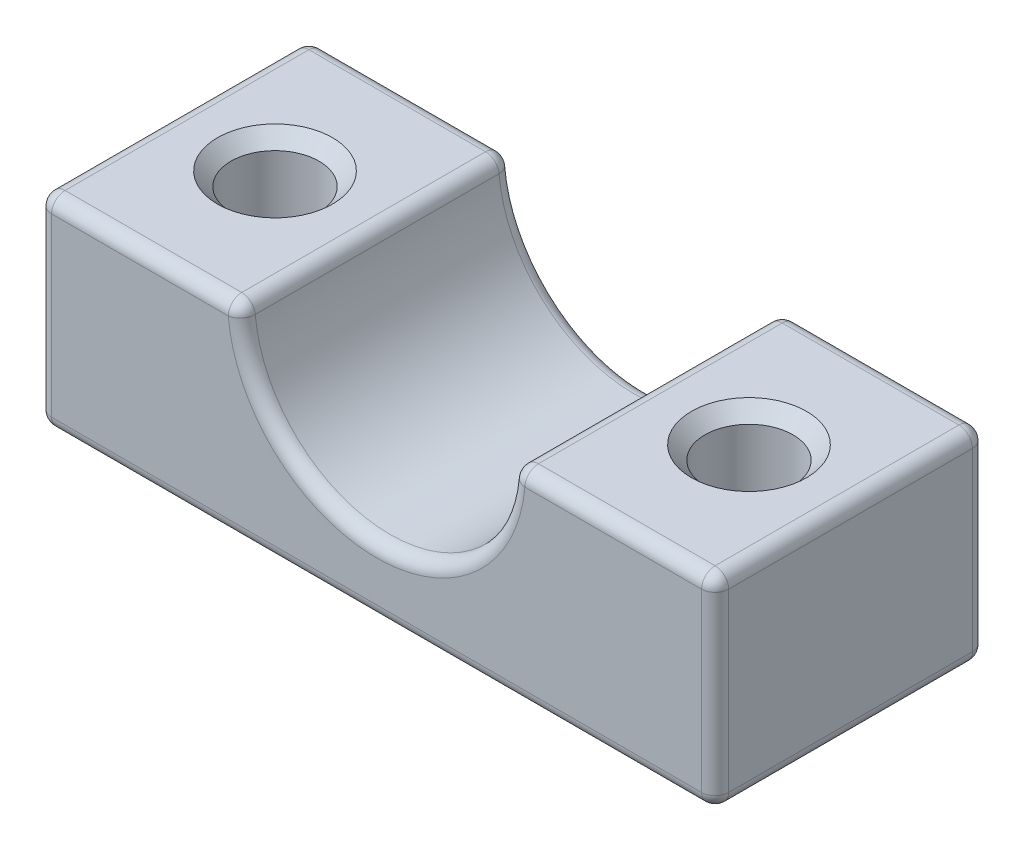
ISO-10303-21;
HEADER;
FILE_DESCRIPTION(('STEP AP214'),'2;1');
FILE_NAME('part.step','',(''),(''),'','','');
FILE_SCHEMA(('AUTOMOTIVE_DESIGN { 1 0 10303 214 1 1 1 1 }'));
ENDSEC;
DATA;
#1=APPLICATION_CONTEXT('core data for automotive mechanical design processes');
#2=APPLICATION_PROTOCOL_DEFINITION('international standard','automotive_design',2000,#1);
#3=PRODUCT_CONTEXT('',#1,'mechanical');
#4=PRODUCT('Part','Part','',(#3));
#5=PRODUCT_RELATED_PRODUCT_CATEGORY('part','',(#4));
#6=PRODUCT_DEFINITION_FORMATION('','',#4);
#7=PRODUCT_DEFINITION_CONTEXT('part definition',#1,'design');
#8=PRODUCT_DEFINITION('design','',#6,#7);
#9=PRODUCT_DEFINITION_SHAPE('','',#8);
#10=(LENGTH_UNIT() NAMED_UNIT(*) SI_UNIT(.MILLI.,.METRE.));
#11=(NAMED_UNIT(*) PLANE_ANGLE_UNIT() SI_UNIT($,.RADIAN.));
#12=(NAMED_UNIT(*) SI_UNIT($,.STERADIAN.) SOLID_ANGLE_UNIT());
#13=UNCERTAINTY_MEASURE_WITH_UNIT(LENGTH_MEASURE(1.E-05),#10,'distance_accuracy_value','');
#14=(GEOMETRIC_REPRESENTATION_CONTEXT(3) GLOBAL_UNCERTAINTY_ASSIGNED_CONTEXT((#13)) GLOBAL_UNIT_ASSIGNED_CONTEXT((#10,
#11,#12)) REPRESENTATION_CONTEXT('',''));
#15=CARTESIAN_POINT('',(0.,0.,0.));
#16=DIRECTION('',(0.,0.,1.));
#17=DIRECTION('',(1.,0.,0.));
#18=AXIS2_PLACEMENT_3D('',#15,#16,#17);
#19=CARTESIAN_POINT('',(0.,0.,40.));
#20=DIRECTION('',(0.,0.,-1.));
#21=DIRECTION('',(-1.,0.,0.));
#22=AXIS2_PLACEMENT_3D('',#19,#20,#21);
#23=CYLINDRICAL_SURFACE('',#22,20.);
#24=DIRECTION('',(0.,0.,-1.));
#25=VECTOR('',#24,1.);
#26=CARTESIAN_POINT('',(-19.9171839092788,-1.81818181818182,40.));
#27=LINE('',#26,#25);
#28=CARTESIAN_POINT('',(-19.9171839092788,-1.81818181818182,2.));
#29=VERTEX_POINT('',#28);
#30=CARTESIAN_POINT('',(-19.9171839092788,-1.81818181818182,38.));
#31=VERTEX_POINT('',#30);
#32=EDGE_CURVE('E261',#29,#31,#27,.F.);
#33=ORIENTED_EDGE('',*,*,#32,.T.);
#34=CARTESIAN_POINT('',(0.,0.,38.));
#35=DIRECTION('',(0.,0.,1.));
#36=DIRECTION('',(1.,0.,0.));
#37=AXIS2_PLACEMENT_3D('',#34,#35,#36);
#38=CIRCLE('',#37,20.);
#39=CARTESIAN_POINT('',(19.9171839092788,-1.81818181818182,38.));
#40=VERTEX_POINT('',#39);
#41=EDGE_CURVE('E264',#31,#40,#38,.T.);
#42=ORIENTED_EDGE('',*,*,#41,.T.);
#43=DIRECTION('',(0.,0.,-1.));
#44=VECTOR('',#43,1.);
#45=CARTESIAN_POINT('',(19.9171839092788,-1.81818181818182,40.));
#46=LINE('',#45,#44);
#47=CARTESIAN_POINT('',(19.9171839092788,-1.81818181818182,2.));
#48=VERTEX_POINT('',#47);
#49=EDGE_CURVE('E258',#40,#48,#46,.T.);
#50=ORIENTED_EDGE('',*,*,#49,.T.);
#51=CARTESIAN_POINT('',(0.,0.,2.));
#52=DIRECTION('',(0.,0.,1.));
#53=DIRECTION('',(1.,0.,0.));
#54=AXIS2_PLACEMENT_3D('',#51,#52,#53);
#55=CIRCLE('',#54,20.);
#56=EDGE_CURVE('E255',#48,#29,#55,.F.);
#57=ORIENTED_EDGE('',*,*,#56,.T.);
#58=EDGE_LOOP('',(#33,#42,#50,#57));
#59=FACE_BOUND('',#58,.T.);
#60=ADVANCED_FACE('F47',(#59),#23,.F.);
#61=CARTESIAN_POINT('',(0.,0.,40.));
#62=DIRECTION('',(0.,1.,0.));
#63=DIRECTION('',(0.,0.,1.));
#64=AXIS2_PLACEMENT_3D('',#61,#62,#63);
#65=PLANE('',#64);
#66=DIRECTION('',(0.,0.,-1.));
#67=VECTOR('',#66,1.);
#68=CARTESIAN_POINT('',(-48.,0.,40.));
#69=LINE('',#68,#67);
#70=CARTESIAN_POINT('',(-48.,0.,2.));
#71=VERTEX_POINT('',#70);
#72=CARTESIAN_POINT('',(-48.,0.,38.));
#73=VERTEX_POINT('',#72);
#74=EDGE_CURVE('E248',#71,#73,#69,.F.);
#75=ORIENTED_EDGE('',*,*,#74,.T.);
#76=DIRECTION('',(1.,0.,0.));
#77=VECTOR('',#76,1.);
#78=CARTESIAN_POINT('',(0.,0.,38.));
#79=LINE('',#78,#77);
#80=CARTESIAN_POINT('',(-21.9089023002067,0.,38.));
#81=VERTEX_POINT('',#80);
#82=EDGE_CURVE('E251',#73,#81,#79,.T.);
#83=ORIENTED_EDGE('',*,*,#82,.T.);
#84=DIRECTION('',(0.,0.,-1.));
#85=VECTOR('',#84,1.);
#86=CARTESIAN_POINT('',(-21.9089023002067,0.,40.));
#87=LINE('',#86,#85);
#88=CARTESIAN_POINT('',(-21.9089023002067,0.,2.));
#89=VERTEX_POINT('',#88);
#90=EDGE_CURVE('E245',#81,#89,#87,.T.);
#91=ORIENTED_EDGE('',*,*,#90,.T.);
#92=DIRECTION('',(1.,0.,0.));
#93=VECTOR('',#92,1.);
#94=CARTESIAN_POINT('',(-50.,0.,2.));
#95=LINE('',#94,#93);
#96=EDGE_CURVE('E242',#89,#71,#95,.F.);
#97=ORIENTED_EDGE('',*,*,#96,.T.);
#98=EDGE_LOOP('',(#75,#83,#91,#97));
#99=FACE_BOUND('',#98,.T.);
#100=CARTESIAN_POINT('',(-35.,0.,20.));
#101=DIRECTION('',(0.,1.,0.));
#102=DIRECTION('',(0.,0.,1.));
#103=AXIS2_PLACEMENT_3D('',#100,#101,#102);
#104=CIRCLE('',#103,8.49999999999999);
#105=CARTESIAN_POINT('',(-35.,0.,28.5));
#106=VERTEX_POINT('',#105);
#107=EDGE_CURVE('E205',#106,#106,#104,.F.);
#108=ORIENTED_EDGE('',*,*,#107,.T.);
#109=EDGE_LOOP('',(#108));
#110=FACE_BOUND('',#109,.T.);
#111=ADVANCED_FACE('F557',(#99,#110),#65,.T.);
#112=CARTESIAN_POINT('',(-50.,0.,40.));
#113=DIRECTION('',(-1.,0.,0.));
#114=DIRECTION('',(0.,0.,1.));
#115=AXIS2_PLACEMENT_3D('',#112,#113,#114);
#116=PLANE('',#115);
#117=DIRECTION('',(0.,0.,-1.));
#118=VECTOR('',#117,1.);
#119=CARTESIAN_POINT('',(-50.,-28.,40.));
#120=LINE('',#119,#118);
#121=CARTESIAN_POINT('',(-50.,-28.,2.));
#122=VERTEX_POINT('',#121);
#123=CARTESIAN_POINT('',(-50.,-28.,38.));
#124=VERTEX_POINT('',#123);
#125=EDGE_CURVE('E235',#122,#124,#120,.F.);
#126=ORIENTED_EDGE('',*,*,#125,.T.);
#127=DIRECTION('',(0.,1.,0.));
#128=VECTOR('',#127,1.);
#129=CARTESIAN_POINT('',(-50.,0.,38.));
#130=LINE('',#129,#128);
#131=CARTESIAN_POINT('',(-50.,-2.,38.));
#132=VERTEX_POINT('',#131);
#133=EDGE_CURVE('E238',#124,#132,#130,.T.);
#134=ORIENTED_EDGE('',*,*,#133,.T.);
#135=DIRECTION('',(0.,0.,-1.));
#136=VECTOR('',#135,1.);
#137=CARTESIAN_POINT('',(-50.,-2.,40.));
#138=LINE('',#137,#136);
#139=CARTESIAN_POINT('',(-50.,-2.,2.));
#140=VERTEX_POINT('',#139);
#141=EDGE_CURVE('E232',#132,#140,#138,.T.);
#142=ORIENTED_EDGE('',*,*,#141,.T.);
#143=DIRECTION('',(0.,1.,0.));
#144=VECTOR('',#143,1.);
#145=CARTESIAN_POINT('',(-50.,-30.,2.));
#146=LINE('',#145,#144);
#147=EDGE_CURVE('E229',#140,#122,#146,.F.);
#148=ORIENTED_EDGE('',*,*,#147,.T.);
#149=EDGE_LOOP('',(#126,#134,#142,#148));
#150=FACE_BOUND('',#149,.T.);
#151=ADVANCED_FACE('F562',(#150),#116,.T.);
#152=CARTESIAN_POINT('',(0.,-30.,40.));
#153=DIRECTION('',(0.,1.,0.));
#154=DIRECTION('',(0.,0.,1.));
#155=AXIS2_PLACEMENT_3D('',#152,#153,#154);
#156=PLANE('',#155);
#157=DIRECTION('',(0.,0.,-1.));
#158=VECTOR('',#157,1.);
#159=CARTESIAN_POINT('',(48.,-30.,40.));
#160=LINE('',#159,#158);
#161=CARTESIAN_POINT('',(48.,-30.,2.));
#162=VERTEX_POINT('',#161);
#163=CARTESIAN_POINT('',(48.,-30.,38.));
#164=VERTEX_POINT('',#163);
#165=EDGE_CURVE('E216',#162,#164,#160,.F.);
#166=ORIENTED_EDGE('',*,*,#165,.T.);
#167=DIRECTION('',(1.,0.,0.));
#168=VECTOR('',#167,1.);
#169=CARTESIAN_POINT('',(-50.,-30.,38.));
#170=LINE('',#169,#168);
#171=CARTESIAN_POINT('',(-48.,-30.,38.));
#172=VERTEX_POINT('',#171);
#173=EDGE_CURVE('E179',#164,#172,#170,.F.);
#174=ORIENTED_EDGE('',*,*,#173,.T.);
#175=DIRECTION('',(0.,0.,-1.));
#176=VECTOR('',#175,1.);
#177=CARTESIAN_POINT('',(-48.,-30.,0.));
#178=LINE('',#177,#176);
#179=CARTESIAN_POINT('',(-48.,-30.,2.));
#180=VERTEX_POINT('',#179);
#181=EDGE_CURVE('E224',#172,#180,#178,.T.);
#182=ORIENTED_EDGE('',*,*,#181,.T.);
#183=DIRECTION('',(1.,0.,0.));
#184=VECTOR('',#183,1.);
#185=CARTESIAN_POINT('',(0.,-30.,2.));
#186=LINE('',#185,#184);
#187=EDGE_CURVE('E212',#180,#162,#186,.T.);
#188=ORIENTED_EDGE('',*,*,#187,.T.);
#189=EDGE_LOOP('',(#166,#174,#182,#188));
#190=FACE_BOUND('',#189,.T.);
#191=CARTESIAN_POINT('',(35.,-30.,20.));
#192=DIRECTION('',(0.,1.,0.));
#193=DIRECTION('',(0.,0.,1.));
#194=AXIS2_PLACEMENT_3D('',#191,#192,#193);
#195=CIRCLE('',#194,8.50000000000001);
#196=CARTESIAN_POINT('',(35.,-30.,28.5));
#197=VERTEX_POINT('',#196);
#198=EDGE_CURVE('E450',#197,#197,#195,.T.);
#199=ORIENTED_EDGE('',*,*,#198,.T.);
#200=EDGE_LOOP('',(#199));
#201=FACE_BOUND('',#200,.T.);
#202=CARTESIAN_POINT('',(-35.,-30.,20.));
#203=DIRECTION('',(0.,1.,0.));
#204=DIRECTION('',(0.,0.,1.));
#205=AXIS2_PLACEMENT_3D('',#202,#203,#204);
#206=CIRCLE('',#205,8.50000000000001);
#207=CARTESIAN_POINT('',(-35.,-30.,28.5));
#208=VERTEX_POINT('',#207);
#209=EDGE_CURVE('E444',#208,#208,#206,.T.);
#210=ORIENTED_EDGE('',*,*,#209,.T.);
#211=EDGE_LOOP('',(#210));
#212=FACE_BOUND('',#211,.T.);
#213=ADVANCED_FACE('F500',(#190,#201,#212),#156,.F.);
#214=CARTESIAN_POINT('',(50.,0.,40.));
#215=DIRECTION('',(-1.,0.,0.));
#216=DIRECTION('',(0.,0.,1.));
#217=AXIS2_PLACEMENT_3D('',#214,#215,#216);
#218=PLANE('',#217);
#219=DIRECTION('',(0.,1.,0.));
#220=VECTOR('',#219,1.);
#221=CARTESIAN_POINT('',(50.,-30.,38.));
#222=LINE('',#221,#220);
#223=CARTESIAN_POINT('',(50.,-2.,38.));
#224=VERTEX_POINT('',#223);
#225=CARTESIAN_POINT('',(50.,-28.,38.));
#226=VERTEX_POINT('',#225);
#227=EDGE_CURVE('E287',#224,#226,#222,.F.);
#228=ORIENTED_EDGE('',*,*,#227,.T.);
#229=DIRECTION('',(0.,0.,-1.));
#230=VECTOR('',#229,1.);
#231=CARTESIAN_POINT('',(50.,-28.,40.));
#232=LINE('',#231,#230);
#233=CARTESIAN_POINT('',(50.,-28.,2.));
#234=VERTEX_POINT('',#233);
#235=EDGE_CURVE('E290',#226,#234,#232,.T.);
#236=ORIENTED_EDGE('',*,*,#235,.T.);
#237=DIRECTION('',(0.,1.,0.));
#238=VECTOR('',#237,1.);
#239=CARTESIAN_POINT('',(50.,0.,2.));
#240=LINE('',#239,#238);
#241=CARTESIAN_POINT('',(50.,-2.,2.));
#242=VERTEX_POINT('',#241);
#243=EDGE_CURVE('E281',#234,#242,#240,.T.);
#244=ORIENTED_EDGE('',*,*,#243,.T.);
#245=DIRECTION('',(0.,0.,-1.));
#246=VECTOR('',#245,1.);
#247=CARTESIAN_POINT('',(50.,-2.,40.));
#248=LINE('',#247,#246);
#249=EDGE_CURVE('E284',#242,#224,#248,.F.);
#250=ORIENTED_EDGE('',*,*,#249,.T.);
#251=EDGE_LOOP('',(#228,#236,#244,#250));
#252=FACE_BOUND('',#251,.T.);
#253=ADVANCED_FACE('F509',(#252),#218,.F.);
#254=DIRECTION('',(0.,0.,-1.));
#255=VECTOR('',#254,1.);
#256=CARTESIAN_POINT('',(21.9089023002066,0.,40.));
#257=LINE('',#256,#255);
#258=CARTESIAN_POINT('',(21.9089023002066,0.,2.));
#259=VERTEX_POINT('',#258);
#260=CARTESIAN_POINT('',(21.9089023002066,0.,38.));
#261=VERTEX_POINT('',#260);
#262=EDGE_CURVE('E274',#259,#261,#257,.F.);
#263=ORIENTED_EDGE('',*,*,#262,.T.);
#264=DIRECTION('',(1.,0.,0.));
#265=VECTOR('',#264,1.);
#266=CARTESIAN_POINT('',(0.,0.,38.));
#267=LINE('',#266,#265);
#268=CARTESIAN_POINT('',(48.,0.,38.));
#269=VERTEX_POINT('',#268);
#270=EDGE_CURVE('E277',#261,#269,#267,.T.);
#271=ORIENTED_EDGE('',*,*,#270,.T.);
#272=DIRECTION('',(0.,0.,-1.));
#273=VECTOR('',#272,1.);
#274=CARTESIAN_POINT('',(48.,0.,0.));
#275=LINE('',#274,#273);
#276=CARTESIAN_POINT('',(48.,0.,2.));
#277=VERTEX_POINT('',#276);
#278=EDGE_CURVE('E271',#269,#277,#275,.T.);
#279=ORIENTED_EDGE('',*,*,#278,.T.);
#280=DIRECTION('',(1.,0.,0.));
#281=VECTOR('',#280,1.);
#282=CARTESIAN_POINT('',(20.,0.,2.));
#283=LINE('',#282,#281);
#284=EDGE_CURVE('E268',#277,#259,#283,.F.);
#285=ORIENTED_EDGE('',*,*,#284,.T.);
#286=EDGE_LOOP('',(#263,#271,#279,#285));
#287=FACE_BOUND('',#286,.T.);
#288=CARTESIAN_POINT('',(35.,0.,20.));
#289=DIRECTION('',(0.,1.,0.));
#290=DIRECTION('',(0.,0.,1.));
#291=AXIS2_PLACEMENT_3D('',#288,#289,#290);
#292=CIRCLE('',#291,8.49999999999999);
#293=CARTESIAN_POINT('',(35.,0.,28.5));
#294=VERTEX_POINT('',#293);
#295=EDGE_CURVE('E454',#294,#294,#292,.F.);
#296=ORIENTED_EDGE('',*,*,#295,.T.);
#297=EDGE_LOOP('',(#296));
#298=FACE_BOUND('',#297,.T.);
#299=ADVANCED_FACE('F565',(#287,#298),#65,.T.);
#300=CARTESIAN_POINT('',(0.,0.,40.));
#301=DIRECTION('',(0.,0.,1.));
#302=DIRECTION('',(1.,0.,0.));
#303=AXIS2_PLACEMENT_3D('',#300,#301,#302);
#304=PLANE('',#303);
#305=DIRECTION('',(0.,1.,0.));
#306=VECTOR('',#305,1.);
#307=CARTESIAN_POINT('',(-48.,0.,40.));
#308=LINE('',#307,#306);
#309=CARTESIAN_POINT('',(-48.,-2.,40.));
#310=VERTEX_POINT('',#309);
#311=CARTESIAN_POINT('',(-48.,-28.,40.));
#312=VERTEX_POINT('',#311);
#313=EDGE_CURVE('E209',#310,#312,#308,.F.);
#314=ORIENTED_EDGE('',*,*,#313,.T.);
#315=DIRECTION('',(1.,0.,0.));
#316=VECTOR('',#315,1.);
#317=CARTESIAN_POINT('',(50.,-28.,40.));
#318=LINE('',#317,#316);
#319=CARTESIAN_POINT('',(48.,-28.,40.));
#320=VERTEX_POINT('',#319);
#321=EDGE_CURVE('E177',#312,#320,#318,.T.);
#322=ORIENTED_EDGE('',*,*,#321,.T.);
#323=DIRECTION('',(0.,1.,0.));
#324=VECTOR('',#323,1.);
#325=CARTESIAN_POINT('',(48.,0.,40.));
#326=LINE('',#325,#324);
#327=CARTESIAN_POINT('',(48.,-2.,40.));
#328=VERTEX_POINT('',#327);
#329=EDGE_CURVE('E197',#320,#328,#326,.T.);
#330=ORIENTED_EDGE('',*,*,#329,.T.);
#331=DIRECTION('',(1.,0.,0.));
#332=VECTOR('',#331,1.);
#333=CARTESIAN_POINT('',(0.,-2.,40.));
#334=LINE('',#333,#332);
#335=CARTESIAN_POINT('',(21.9089023002066,-2.,40.));
#336=VERTEX_POINT('',#335);
#337=EDGE_CURVE('E204',#328,#336,#334,.F.);
#338=ORIENTED_EDGE('',*,*,#337,.T.);
#339=CARTESIAN_POINT('',(0.,0.,40.));
#340=DIRECTION('',(0.,0.,1.));
#341=DIRECTION('',(1.,0.,0.));
#342=AXIS2_PLACEMENT_3D('',#339,#340,#341);
#343=CIRCLE('',#342,22.);
#344=CARTESIAN_POINT('',(-21.9089023002067,-2.,40.));
#345=VERTEX_POINT('',#344);
#346=EDGE_CURVE('E471',#336,#345,#343,.F.);
#347=ORIENTED_EDGE('',*,*,#346,.T.);
#348=DIRECTION('',(1.,0.,0.));
#349=VECTOR('',#348,1.);
#350=CARTESIAN_POINT('',(0.,-2.,40.));
#351=LINE('',#350,#349);
#352=EDGE_CURVE('E218',#345,#310,#351,.F.);
#353=ORIENTED_EDGE('',*,*,#352,.T.);
#354=EDGE_LOOP('',(#314,#322,#330,#338,#347,#353));
#355=FACE_BOUND('',#354,.T.);
#356=ADVANCED_FACE('F207',(#355),#304,.T.);
#357=CARTESIAN_POINT('',(0.,0.,0.));
#358=DIRECTION('',(0.,0.,1.));
#359=DIRECTION('',(1.,0.,0.));
#360=AXIS2_PLACEMENT_3D('',#357,#358,#359);
#361=PLANE('',#360);
#362=DIRECTION('',(0.,1.,0.));
#363=VECTOR('',#362,1.);
#364=CARTESIAN_POINT('',(-48.,0.,0.));
#365=LINE('',#364,#363);
#366=CARTESIAN_POINT('',(-48.,-28.,0.));
#367=VERTEX_POINT('',#366);
#368=CARTESIAN_POINT('',(-48.,-2.,0.));
#369=VERTEX_POINT('',#368);
#370=EDGE_CURVE('E57',#367,#369,#365,.T.);
#371=ORIENTED_EDGE('',*,*,#370,.T.);
#372=DIRECTION('',(1.,0.,0.));
#373=VECTOR('',#372,1.);
#374=CARTESIAN_POINT('',(-20.,-2.,0.));
#375=LINE('',#374,#373);
#376=CARTESIAN_POINT('',(-21.9089023002067,-2.,0.));
#377=VERTEX_POINT('',#376);
#378=EDGE_CURVE('E11',#369,#377,#375,.T.);
#379=ORIENTED_EDGE('',*,*,#378,.T.);
#380=CARTESIAN_POINT('',(0.,0.,0.));
#381=DIRECTION('',(0.,0.,1.));
#382=DIRECTION('',(1.,0.,0.));
#383=AXIS2_PLACEMENT_3D('',#380,#381,#382);
#384=CIRCLE('',#383,22.);
#385=CARTESIAN_POINT('',(21.9089023002066,-2.,0.));
#386=VERTEX_POINT('',#385);
#387=EDGE_CURVE('E294',#377,#386,#384,.T.);
#388=ORIENTED_EDGE('',*,*,#387,.T.);
#389=DIRECTION('',(1.,0.,0.));
#390=VECTOR('',#389,1.);
#391=CARTESIAN_POINT('',(50.,-2.,0.));
#392=LINE('',#391,#390);
#393=CARTESIAN_POINT('',(48.,-2.,0.));
#394=VERTEX_POINT('',#393);
#395=EDGE_CURVE('E297',#386,#394,#392,.T.);
#396=ORIENTED_EDGE('',*,*,#395,.T.);
#397=DIRECTION('',(0.,1.,0.));
#398=VECTOR('',#397,1.);
#399=CARTESIAN_POINT('',(48.,0.,0.));
#400=LINE('',#399,#398);
#401=CARTESIAN_POINT('',(48.,-28.,0.));
#402=VERTEX_POINT('',#401);
#403=EDGE_CURVE('E300',#394,#402,#400,.F.);
#404=ORIENTED_EDGE('',*,*,#403,.T.);
#405=DIRECTION('',(1.,0.,0.));
#406=VECTOR('',#405,1.);
#407=CARTESIAN_POINT('',(0.,-28.,0.));
#408=LINE('',#407,#406);
#409=EDGE_CURVE('E68',#402,#367,#408,.F.);
#410=ORIENTED_EDGE('',*,*,#409,.T.);
#411=EDGE_LOOP('',(#371,#379,#388,#396,#404,#410));
#412=FACE_BOUND('',#411,.T.);
#413=ADVANCED_FACE('F655',(#412),#361,.F.);
#414=CARTESIAN_POINT('',(35.,-30.001,20.));
#415=DIRECTION('',(0.,1.,0.));
#416=DIRECTION('',(0.,0.,1.));
#417=AXIS2_PLACEMENT_3D('',#414,#415,#416);
#418=CYLINDRICAL_SURFACE('',#417,6.5);
#419=CARTESIAN_POINT('',(35.,-28.,20.));
#420=DIRECTION('',(0.,1.,0.));
#421=DIRECTION('',(0.,0.,1.));
#422=AXIS2_PLACEMENT_3D('',#419,#420,#421);
#423=CIRCLE('',#422,6.5);
#424=CARTESIAN_POINT('',(35.,-28.,26.5));
#425=VERTEX_POINT('',#424);
#426=EDGE_CURVE('E438',#425,#425,#423,.F.);
#427=ORIENTED_EDGE('',*,*,#426,.T.);
#428=EDGE_LOOP('',(#427));
#429=FACE_BOUND('',#428,.T.);
#430=CARTESIAN_POINT('',(35.,-2.,20.));
#431=DIRECTION('',(0.,1.,0.));
#432=DIRECTION('',(0.,0.,1.));
#433=AXIS2_PLACEMENT_3D('',#430,#431,#432);
#434=CIRCLE('',#433,6.5);
#435=CARTESIAN_POINT('',(35.,-2.,26.5));
#436=VERTEX_POINT('',#435);
#437=EDGE_CURVE('E430',#436,#436,#434,.T.);
#438=ORIENTED_EDGE('',*,*,#437,.T.);
#439=EDGE_LOOP('',(#438));
#440=FACE_BOUND('',#439,.T.);
#441=ADVANCED_FACE('F960',(#429,#440),#418,.F.);
#442=CARTESIAN_POINT('',(-35.,-30.001,20.));
#443=DIRECTION('',(0.,1.,0.));
#444=DIRECTION('',(0.,0.,1.));
#445=AXIS2_PLACEMENT_3D('',#442,#443,#444);
#446=CYLINDRICAL_SURFACE('',#445,6.5);
#447=CARTESIAN_POINT('',(-35.,-28.,20.));
#448=DIRECTION('',(0.,1.,0.));
#449=DIRECTION('',(0.,0.,1.));
#450=AXIS2_PLACEMENT_3D('',#447,#448,#449);
#451=CIRCLE('',#450,6.5);
#452=CARTESIAN_POINT('',(-35.,-28.,26.5));
#453=VERTEX_POINT('',#452);
#454=EDGE_CURVE('E462',#453,#453,#451,.F.);
#455=ORIENTED_EDGE('',*,*,#454,.T.);
#456=EDGE_LOOP('',(#455));
#457=FACE_BOUND('',#456,.T.);
#458=CARTESIAN_POINT('',(-35.,-2.,20.));
#459=DIRECTION('',(0.,1.,0.));
#460=DIRECTION('',(0.,0.,1.));
#461=AXIS2_PLACEMENT_3D('',#458,#459,#460);
#462=CIRCLE('',#461,6.5);
#463=CARTESIAN_POINT('',(-35.,-2.,26.5));
#464=VERTEX_POINT('',#463);
#465=EDGE_CURVE('E458',#464,#464,#462,.T.);
#466=ORIENTED_EDGE('',*,*,#465,.T.);
#467=EDGE_LOOP('',(#466));
#468=FACE_BOUND('',#467,.T.);
#469=ADVANCED_FACE('F577',(#457,#468),#446,.F.);
#470=CARTESIAN_POINT('',(35.,-28.,20.));
#471=DIRECTION('',(0.,-1.,0.));
#472=DIRECTION('',(0.,0.,-1.));
#473=AXIS2_PLACEMENT_3D('',#470,#471,#472);
#474=CONICAL_SURFACE('',#473,6.5,0.78539816339745);
#475=ORIENTED_EDGE('',*,*,#198,.F.);
#476=EDGE_LOOP('',(#475));
#477=FACE_BOUND('',#476,.T.);
#478=ORIENTED_EDGE('',*,*,#426,.F.);
#479=EDGE_LOOP('',(#478));
#480=FACE_BOUND('',#479,.T.);
#481=ADVANCED_FACE('F570',(#477,#480),#474,.F.);
#482=CARTESIAN_POINT('',(35.,-2.,20.));
#483=DIRECTION('',(0.,1.,0.));
#484=DIRECTION('',(0.,0.,1.));
#485=AXIS2_PLACEMENT_3D('',#482,#483,#484);
#486=CONICAL_SURFACE('',#485,6.5,0.785398163397446);
#487=ORIENTED_EDGE('',*,*,#295,.F.);
#488=EDGE_LOOP('',(#487));
#489=FACE_BOUND('',#488,.T.);
#490=ORIENTED_EDGE('',*,*,#437,.F.);
#491=EDGE_LOOP('',(#490));
#492=FACE_BOUND('',#491,.T.);
#493=ADVANCED_FACE('F576',(#489,#492),#486,.F.);
#494=CARTESIAN_POINT('',(-35.,-28.,20.));
#495=DIRECTION('',(0.,-1.,0.));
#496=DIRECTION('',(0.,0.,-1.));
#497=AXIS2_PLACEMENT_3D('',#494,#495,#496);
#498=CONICAL_SURFACE('',#497,6.5,0.78539816339745);
#499=ORIENTED_EDGE('',*,*,#209,.F.);
#500=EDGE_LOOP('',(#499));
#501=FACE_BOUND('',#500,.T.);
#502=ORIENTED_EDGE('',*,*,#454,.F.);
#503=EDGE_LOOP('',(#502));
#504=FACE_BOUND('',#503,.T.);
#505=ADVANCED_FACE('F584',(#501,#504),#498,.F.);
#506=CARTESIAN_POINT('',(-35.,-2.,20.));
#507=DIRECTION('',(0.,1.,0.));
#508=DIRECTION('',(0.,0.,1.));
#509=AXIS2_PLACEMENT_3D('',#506,#507,#508);
#510=CONICAL_SURFACE('',#509,6.5,0.785398163397446);
#511=ORIENTED_EDGE('',*,*,#107,.F.);
#512=EDGE_LOOP('',(#511));
#513=FACE_BOUND('',#512,.T.);
#514=ORIENTED_EDGE('',*,*,#465,.F.);
#515=EDGE_LOOP('',(#514));
#516=FACE_BOUND('',#515,.T.);
#517=ADVANCED_FACE('F591',(#513,#516),#510,.F.);
#518=CARTESIAN_POINT('',(0.,0.,2.));
#519=DIRECTION('',(0.,0.,1.));
#520=DIRECTION('',(1.,0.,0.));
#521=AXIS2_PLACEMENT_3D('',#518,#519,#520);
#522=TOROIDAL_SURFACE('',#521,22.,2.);
#523=CARTESIAN_POINT('',(-21.9089023002067,-2.,2.));
#524=DIRECTION('',(-0.0909090909090906,0.995859195463939,0.));
#525=DIRECTION('',(-0.995859195463939,-0.0909090909090906,0.));
#526=AXIS2_PLACEMENT_3D('',#523,#524,#525);
#527=CIRCLE('',#526,2.);
#528=EDGE_CURVE('E51',#29,#377,#527,.T.);
#529=ORIENTED_EDGE('',*,*,#528,.F.);
#530=ORIENTED_EDGE('',*,*,#56,.F.);
#531=CARTESIAN_POINT('',(21.9089023002066,-2.,2.));
#532=DIRECTION('',(0.0909090909090904,0.995859195463938,0.));
#533=DIRECTION('',(-0.995859195463939,0.0909090909090905,0.));
#534=AXIS2_PLACEMENT_3D('',#531,#532,#533);
#535=CIRCLE('',#534,2.);
#536=EDGE_CURVE('E421',#386,#48,#535,.T.);
#537=ORIENTED_EDGE('',*,*,#536,.F.);
#538=ORIENTED_EDGE('',*,*,#387,.F.);
#539=EDGE_LOOP('',(#529,#530,#537,#538));
#540=FACE_BOUND('',#539,.T.);
#541=ADVANCED_FACE('F49',(#540),#522,.T.);
#542=CARTESIAN_POINT('',(-21.9089023002067,-2.,2.));
#543=DIRECTION('',(0.,0.,-1.));
#544=DIRECTION('',(-1.,0.,0.));
#545=AXIS2_PLACEMENT_3D('',#542,#543,#544);
#546=SPHERICAL_SURFACE('',#545,2.);
#547=CARTESIAN_POINT('',(-21.9089023002067,-2.,2.));
#548=DIRECTION('',(0.,0.,-1.));
#549=DIRECTION('',(-1.,0.,0.));
#550=AXIS2_PLACEMENT_3D('',#547,#548,#549);
#551=CIRCLE('',#550,2.);
#552=EDGE_CURVE('E415',#29,#89,#551,.F.);
#553=ORIENTED_EDGE('',*,*,#552,.F.);
#554=ORIENTED_EDGE('',*,*,#528,.T.);
#555=CARTESIAN_POINT('',(-21.9089023002067,-2.,2.));
#556=DIRECTION('',(1.,0.,0.));
#557=DIRECTION('',(0.,0.,-1.));
#558=AXIS2_PLACEMENT_3D('',#555,#556,#557);
#559=CIRCLE('',#558,2.);
#560=EDGE_CURVE('E419',#89,#377,#559,.F.);
#561=ORIENTED_EDGE('',*,*,#560,.F.);
#562=EDGE_LOOP('',(#553,#554,#561));
#563=FACE_BOUND('',#562,.T.);
#564=ADVANCED_FACE('F691',(#563),#546,.T.);
#565=CARTESIAN_POINT('',(21.9089023002066,-2.,2.));
#566=DIRECTION('',(0.,0.,-1.));
#567=DIRECTION('',(-1.,0.,0.));
#568=AXIS2_PLACEMENT_3D('',#565,#566,#567);
#569=SPHERICAL_SURFACE('',#568,2.);
#570=CARTESIAN_POINT('',(21.9089023002066,-2.,2.));
#571=DIRECTION('',(-1.,0.,0.));
#572=DIRECTION('',(0.,0.,1.));
#573=AXIS2_PLACEMENT_3D('',#570,#571,#572);
#574=CIRCLE('',#573,2.);
#575=EDGE_CURVE('E407',#386,#259,#574,.F.);
#576=ORIENTED_EDGE('',*,*,#575,.F.);
#577=ORIENTED_EDGE('',*,*,#536,.T.);
#578=CARTESIAN_POINT('',(21.9089023002066,-2.,2.));
#579=DIRECTION('',(0.,0.,-1.));
#580=DIRECTION('',(0.,1.,0.));
#581=AXIS2_PLACEMENT_3D('',#578,#579,#580);
#582=CIRCLE('',#581,2.);
#583=EDGE_CURVE('E411',#259,#48,#582,.F.);
#584=ORIENTED_EDGE('',*,*,#583,.F.);
#585=EDGE_LOOP('',(#576,#577,#584));
#586=FACE_BOUND('',#585,.T.);
#587=ADVANCED_FACE('F668',(#586),#569,.T.);
#588=CARTESIAN_POINT('',(0.,-2.,2.));
#589=DIRECTION('',(-1.,0.,0.));
#590=DIRECTION('',(0.,0.,1.));
#591=AXIS2_PLACEMENT_3D('',#588,#589,#590);
#592=CYLINDRICAL_SURFACE('',#591,2.);
#593=ORIENTED_EDGE('',*,*,#560,.T.);
#594=ORIENTED_EDGE('',*,*,#378,.F.);
#595=CARTESIAN_POINT('',(-48.,-2.,2.));
#596=DIRECTION('',(-1.,0.,0.));
#597=DIRECTION('',(0.,0.,1.));
#598=AXIS2_PLACEMENT_3D('',#595,#596,#597);
#599=CIRCLE('',#598,2.);
#600=EDGE_CURVE('E403',#71,#369,#599,.T.);
#601=ORIENTED_EDGE('',*,*,#600,.F.);
#602=ORIENTED_EDGE('',*,*,#96,.F.);
#603=EDGE_LOOP('',(#593,#594,#601,#602));
#604=FACE_BOUND('',#603,.T.);
#605=ADVANCED_FACE('F666',(#604),#592,.T.);
#606=CARTESIAN_POINT('',(-21.9089023002067,-2.,40.));
#607=DIRECTION('',(0.,0.,-1.));
#608=DIRECTION('',(-1.,0.,0.));
#609=AXIS2_PLACEMENT_3D('',#606,#607,#608);
#610=CYLINDRICAL_SURFACE('',#609,2.);
#611=ORIENTED_EDGE('',*,*,#552,.T.);
#612=ORIENTED_EDGE('',*,*,#90,.F.);
#613=CARTESIAN_POINT('',(-21.9089023002067,-2.,38.));
#614=DIRECTION('',(0.,0.,1.));
#615=DIRECTION('',(1.,0.,0.));
#616=AXIS2_PLACEMENT_3D('',#613,#614,#615);
#617=CIRCLE('',#616,2.);
#618=EDGE_CURVE('E399',#31,#81,#617,.T.);
#619=ORIENTED_EDGE('',*,*,#618,.F.);
#620=ORIENTED_EDGE('',*,*,#32,.F.);
#621=EDGE_LOOP('',(#611,#612,#619,#620));
#622=FACE_BOUND('',#621,.T.);
#623=ADVANCED_FACE('F541',(#622),#610,.T.);
#624=CARTESIAN_POINT('',(0.,0.,38.));
#625=DIRECTION('',(0.,0.,1.));
#626=DIRECTION('',(1.,0.,0.));
#627=AXIS2_PLACEMENT_3D('',#624,#625,#626);
#628=TOROIDAL_SURFACE('',#627,22.,2.);
#629=CARTESIAN_POINT('',(21.9089023002066,-2.,38.));
#630=DIRECTION('',(0.0909090909090906,0.995859195463939,0.));
#631=DIRECTION('',(-0.995859195463939,0.0909090909090906,0.));
#632=AXIS2_PLACEMENT_3D('',#629,#630,#631);
#633=CIRCLE('',#632,2.);
#634=EDGE_CURVE('E391',#40,#336,#633,.T.);
#635=ORIENTED_EDGE('',*,*,#634,.F.);
#636=ORIENTED_EDGE('',*,*,#41,.F.);
#637=CARTESIAN_POINT('',(-21.9089023002067,-2.,38.));
#638=DIRECTION('',(-0.0909090909090904,0.995859195463938,0.));
#639=DIRECTION('',(-0.995859195463939,-0.0909090909090905,0.));
#640=AXIS2_PLACEMENT_3D('',#637,#638,#639);
#641=CIRCLE('',#640,2.);
#642=EDGE_CURVE('E395',#345,#31,#641,.T.);
#643=ORIENTED_EDGE('',*,*,#642,.F.);
#644=ORIENTED_EDGE('',*,*,#346,.F.);
#645=EDGE_LOOP('',(#635,#636,#643,#644));
#646=FACE_BOUND('',#645,.T.);
#647=ADVANCED_FACE('F525',(#646),#628,.T.);
#648=CARTESIAN_POINT('',(21.9089023002066,-2.,40.));
#649=DIRECTION('',(0.,0.,-1.));
#650=DIRECTION('',(-1.,0.,0.));
#651=AXIS2_PLACEMENT_3D('',#648,#649,#650);
#652=CYLINDRICAL_SURFACE('',#651,2.);
#653=ORIENTED_EDGE('',*,*,#583,.T.);
#654=ORIENTED_EDGE('',*,*,#49,.F.);
#655=CARTESIAN_POINT('',(21.9089023002066,-2.,38.));
#656=DIRECTION('',(0.,0.,1.));
#657=DIRECTION('',(1.,0.,0.));
#658=AXIS2_PLACEMENT_3D('',#655,#656,#657);
#659=CIRCLE('',#658,2.);
#660=EDGE_CURVE('E388',#261,#40,#659,.T.);
#661=ORIENTED_EDGE('',*,*,#660,.F.);
#662=ORIENTED_EDGE('',*,*,#262,.F.);
#663=EDGE_LOOP('',(#653,#654,#661,#662));
#664=FACE_BOUND('',#663,.T.);
#665=ADVANCED_FACE('F534',(#664),#652,.T.);
#666=CARTESIAN_POINT('',(0.,-2.,2.));
#667=DIRECTION('',(-1.,0.,0.));
#668=DIRECTION('',(0.,0.,1.));
#669=AXIS2_PLACEMENT_3D('',#666,#667,#668);
#670=CYLINDRICAL_SURFACE('',#669,2.);
#671=ORIENTED_EDGE('',*,*,#575,.T.);
#672=ORIENTED_EDGE('',*,*,#284,.F.);
#673=CARTESIAN_POINT('',(48.,-2.,2.));
#674=DIRECTION('',(1.,0.,0.));
#675=DIRECTION('',(0.,0.,-1.));
#676=AXIS2_PLACEMENT_3D('',#673,#674,#675);
#677=CIRCLE('',#676,2.);
#678=EDGE_CURVE('E384',#394,#277,#677,.T.);
#679=ORIENTED_EDGE('',*,*,#678,.F.);
#680=ORIENTED_EDGE('',*,*,#395,.F.);
#681=EDGE_LOOP('',(#671,#672,#679,#680));
#682=FACE_BOUND('',#681,.T.);
#683=ADVANCED_FACE('F553',(#682),#670,.T.);
#684=CARTESIAN_POINT('',(-48.,-2.,2.));
#685=DIRECTION('',(0.,0.,-1.));
#686=DIRECTION('',(-1.,0.,0.));
#687=AXIS2_PLACEMENT_3D('',#684,#685,#686);
#688=SPHERICAL_SURFACE('',#687,2.);
#689=CARTESIAN_POINT('',(-48.,-2.,2.));
#690=DIRECTION('',(0.,0.,-1.));
#691=DIRECTION('',(-1.,0.,0.));
#692=AXIS2_PLACEMENT_3D('',#689,#690,#691);
#693=CIRCLE('',#692,2.);
#694=EDGE_CURVE('E376',#71,#140,#693,.F.);
#695=ORIENTED_EDGE('',*,*,#694,.F.);
#696=ORIENTED_EDGE('',*,*,#600,.T.);
#697=CARTESIAN_POINT('',(-48.,-2.,2.));
#698=DIRECTION('',(0.,1.,0.));
#699=DIRECTION('',(0.,0.,1.));
#700=AXIS2_PLACEMENT_3D('',#697,#698,#699);
#701=CIRCLE('',#700,2.);
#702=EDGE_CURVE('E380',#140,#369,#701,.F.);
#703=ORIENTED_EDGE('',*,*,#702,.F.);
#704=EDGE_LOOP('',(#695,#696,#703));
#705=FACE_BOUND('',#704,.T.);
#706=ADVANCED_FACE('F545',(#705),#688,.T.);
#707=CARTESIAN_POINT('',(-21.9089023002067,-2.,38.));
#708=DIRECTION('',(0.,0.,1.));
#709=DIRECTION('',(1.,0.,0.));
#710=AXIS2_PLACEMENT_3D('',#707,#708,#709);
#711=SPHERICAL_SURFACE('',#710,2.);
#712=ORIENTED_EDGE('',*,*,#642,.T.);
#713=ORIENTED_EDGE('',*,*,#618,.T.);
#714=CARTESIAN_POINT('',(-21.9089023002067,-2.,38.));
#715=DIRECTION('',(1.,0.,0.));
#716=DIRECTION('',(0.,0.,-1.));
#717=AXIS2_PLACEMENT_3D('',#714,#715,#716);
#718=CIRCLE('',#717,2.);
#719=EDGE_CURVE('E373',#345,#81,#718,.F.);
#720=ORIENTED_EDGE('',*,*,#719,.F.);
#721=EDGE_LOOP('',(#712,#713,#720));
#722=FACE_BOUND('',#721,.T.);
#723=ADVANCED_FACE('F543',(#722),#711,.T.);
#724=CARTESIAN_POINT('',(21.9089023002066,-2.,38.));
#725=DIRECTION('',(0.,0.,1.));
#726=DIRECTION('',(1.,0.,0.));
#727=AXIS2_PLACEMENT_3D('',#724,#725,#726);
#728=SPHERICAL_SURFACE('',#727,2.);
#729=ORIENTED_EDGE('',*,*,#660,.T.);
#730=ORIENTED_EDGE('',*,*,#634,.T.);
#731=CARTESIAN_POINT('',(21.9089023002066,-2.,38.));
#732=DIRECTION('',(-1.,0.,0.));
#733=DIRECTION('',(0.,0.,1.));
#734=AXIS2_PLACEMENT_3D('',#731,#732,#733);
#735=CIRCLE('',#734,2.);
#736=EDGE_CURVE('E369',#261,#336,#735,.F.);
#737=ORIENTED_EDGE('',*,*,#736,.F.);
#738=EDGE_LOOP('',(#729,#730,#737));
#739=FACE_BOUND('',#738,.T.);
#740=ADVANCED_FACE('F530',(#739),#728,.T.);
#741=CARTESIAN_POINT('',(48.,-2.,2.));
#742=DIRECTION('',(0.,1.,0.));
#743=DIRECTION('',(0.,0.,1.));
#744=AXIS2_PLACEMENT_3D('',#741,#742,#743);
#745=SPHERICAL_SURFACE('',#744,2.);
#746=CARTESIAN_POINT('',(48.,-2.,2.));
#747=DIRECTION('',(0.,1.,0.));
#748=DIRECTION('',(0.,0.,1.));
#749=AXIS2_PLACEMENT_3D('',#746,#747,#748);
#750=CIRCLE('',#749,2.);
#751=EDGE_CURVE('E361',#394,#242,#750,.F.);
#752=ORIENTED_EDGE('',*,*,#751,.F.);
#753=ORIENTED_EDGE('',*,*,#678,.T.);
#754=CARTESIAN_POINT('',(48.,-2.,2.));
#755=DIRECTION('',(0.,0.,-1.));
#756=DIRECTION('',(-1.,0.,0.));
#757=AXIS2_PLACEMENT_3D('',#754,#755,#756);
#758=CIRCLE('',#757,2.);
#759=EDGE_CURVE('E365',#242,#277,#758,.F.);
#760=ORIENTED_EDGE('',*,*,#759,.F.);
#761=EDGE_LOOP('',(#752,#753,#760));
#762=FACE_BOUND('',#761,.T.);
#763=ADVANCED_FACE('F551',(#762),#745,.T.);
#764=CARTESIAN_POINT('',(-48.,0.,2.));
#765=DIRECTION('',(0.,-1.,0.));
#766=DIRECTION('',(0.,0.,-1.));
#767=AXIS2_PLACEMENT_3D('',#764,#765,#766);
#768=CYLINDRICAL_SURFACE('',#767,2.);
#769=ORIENTED_EDGE('',*,*,#702,.T.);
#770=ORIENTED_EDGE('',*,*,#370,.F.);
#771=CARTESIAN_POINT('',(-48.,-28.,2.));
#772=DIRECTION('',(0.,-1.,0.));
#773=DIRECTION('',(0.,0.,-1.));
#774=AXIS2_PLACEMENT_3D('',#771,#772,#773);
#775=CIRCLE('',#774,2.);
#776=EDGE_CURVE('E353',#122,#367,#775,.T.);
#777=ORIENTED_EDGE('',*,*,#776,.F.);
#778=ORIENTED_EDGE('',*,*,#147,.F.);
#779=EDGE_LOOP('',(#769,#770,#777,#778));
#780=FACE_BOUND('',#779,.T.);
#781=ADVANCED_FACE('F641',(#780),#768,.T.);
#782=CARTESIAN_POINT('',(-48.,-2.,40.));
#783=DIRECTION('',(0.,0.,-1.));
#784=DIRECTION('',(-1.,0.,0.));
#785=AXIS2_PLACEMENT_3D('',#782,#783,#784);
#786=CYLINDRICAL_SURFACE('',#785,2.);
#787=ORIENTED_EDGE('',*,*,#694,.T.);
#788=ORIENTED_EDGE('',*,*,#141,.F.);
#789=CARTESIAN_POINT('',(-48.,-2.,38.));
#790=DIRECTION('',(0.,0.,1.));
#791=DIRECTION('',(1.,0.,0.));
#792=AXIS2_PLACEMENT_3D('',#789,#790,#791);
#793=CIRCLE('',#792,2.);
#794=EDGE_CURVE('E349',#73,#132,#793,.T.);
#795=ORIENTED_EDGE('',*,*,#794,.F.);
#796=ORIENTED_EDGE('',*,*,#74,.F.);
#797=EDGE_LOOP('',(#787,#788,#795,#796));
#798=FACE_BOUND('',#797,.T.);
#799=ADVANCED_FACE('F638',(#798),#786,.T.);
#800=CARTESIAN_POINT('',(0.,-2.,38.));
#801=DIRECTION('',(1.,0.,0.));
#802=DIRECTION('',(0.,0.,-1.));
#803=AXIS2_PLACEMENT_3D('',#800,#801,#802);
#804=CYLINDRICAL_SURFACE('',#803,2.);
#805=ORIENTED_EDGE('',*,*,#719,.T.);
#806=ORIENTED_EDGE('',*,*,#82,.F.);
#807=CARTESIAN_POINT('',(-48.,-2.,38.));
#808=DIRECTION('',(-1.,0.,0.));
#809=DIRECTION('',(0.,0.,1.));
#810=AXIS2_PLACEMENT_3D('',#807,#808,#809);
#811=CIRCLE('',#810,2.);
#812=EDGE_CURVE('E345',#310,#73,#811,.T.);
#813=ORIENTED_EDGE('',*,*,#812,.F.);
#814=ORIENTED_EDGE('',*,*,#352,.F.);
#815=EDGE_LOOP('',(#805,#806,#813,#814));
#816=FACE_BOUND('',#815,.T.);
#817=ADVANCED_FACE('F481',(#816),#804,.T.);
#818=CARTESIAN_POINT('',(0.,-2.,38.));
#819=DIRECTION('',(1.,0.,0.));
#820=DIRECTION('',(0.,0.,-1.));
#821=AXIS2_PLACEMENT_3D('',#818,#819,#820);
#822=CYLINDRICAL_SURFACE('',#821,2.);
#823=ORIENTED_EDGE('',*,*,#736,.T.);
#824=ORIENTED_EDGE('',*,*,#337,.F.);
#825=CARTESIAN_POINT('',(48.,-2.,38.));
#826=DIRECTION('',(1.,0.,0.));
#827=DIRECTION('',(0.,0.,-1.));
#828=AXIS2_PLACEMENT_3D('',#825,#826,#827);
#829=CIRCLE('',#828,2.);
#830=EDGE_CURVE('E341',#269,#328,#829,.T.);
#831=ORIENTED_EDGE('',*,*,#830,.F.);
#832=ORIENTED_EDGE('',*,*,#270,.F.);
#833=EDGE_LOOP('',(#823,#824,#831,#832));
#834=FACE_BOUND('',#833,.T.);
#835=ADVANCED_FACE('F521',(#834),#822,.T.);
#836=CARTESIAN_POINT('',(48.,-2.,40.));
#837=DIRECTION('',(0.,0.,1.));
#838=DIRECTION('',(1.,0.,0.));
#839=AXIS2_PLACEMENT_3D('',#836,#837,#838);
#840=CYLINDRICAL_SURFACE('',#839,2.);
#841=ORIENTED_EDGE('',*,*,#759,.T.);
#842=ORIENTED_EDGE('',*,*,#278,.F.);
#843=CARTESIAN_POINT('',(48.,-2.,38.));
#844=DIRECTION('',(0.,0.,1.));
#845=DIRECTION('',(1.,0.,0.));
#846=AXIS2_PLACEMENT_3D('',#843,#844,#845);
#847=CIRCLE('',#846,2.);
#848=EDGE_CURVE('E338',#224,#269,#847,.T.);
#849=ORIENTED_EDGE('',*,*,#848,.F.);
#850=ORIENTED_EDGE('',*,*,#249,.F.);
#851=EDGE_LOOP('',(#841,#842,#849,#850));
#852=FACE_BOUND('',#851,.T.);
#853=ADVANCED_FACE('F515',(#852),#840,.T.);
#854=CARTESIAN_POINT('',(48.,0.,2.));
#855=DIRECTION('',(0.,1.,0.));
#856=DIRECTION('',(0.,0.,1.));
#857=AXIS2_PLACEMENT_3D('',#854,#855,#856);
#858=CYLINDRICAL_SURFACE('',#857,2.);
#859=ORIENTED_EDGE('',*,*,#751,.T.);
#860=ORIENTED_EDGE('',*,*,#243,.F.);
#861=CARTESIAN_POINT('',(48.,-28.,2.));
#862=DIRECTION('',(0.,-1.,0.));
#863=DIRECTION('',(0.,0.,-1.));
#864=AXIS2_PLACEMENT_3D('',#861,#862,#863);
#865=CIRCLE('',#864,2.);
#866=EDGE_CURVE('E334',#402,#234,#865,.T.);
#867=ORIENTED_EDGE('',*,*,#866,.F.);
#868=ORIENTED_EDGE('',*,*,#403,.F.);
#869=EDGE_LOOP('',(#859,#860,#867,#868));
#870=FACE_BOUND('',#869,.T.);
#871=ADVANCED_FACE('F627',(#870),#858,.T.);
#872=CARTESIAN_POINT('',(0.,-28.,2.));
#873=DIRECTION('',(1.,0.,0.));
#874=DIRECTION('',(0.,0.,-1.));
#875=AXIS2_PLACEMENT_3D('',#872,#873,#874);
#876=CYLINDRICAL_SURFACE('',#875,2.);
#877=CARTESIAN_POINT('',(-48.,-28.,2.));
#878=DIRECTION('',(-1.,0.,0.));
#879=DIRECTION('',(0.,0.,1.));
#880=AXIS2_PLACEMENT_3D('',#877,#878,#879);
#881=CIRCLE('',#880,2.);
#882=EDGE_CURVE('E357',#367,#180,#881,.T.);
#883=ORIENTED_EDGE('',*,*,#882,.F.);
#884=ORIENTED_EDGE('',*,*,#409,.F.);
#885=CARTESIAN_POINT('',(48.,-28.,2.));
#886=DIRECTION('',(1.,0.,0.));
#887=DIRECTION('',(0.,0.,-1.));
#888=AXIS2_PLACEMENT_3D('',#885,#886,#887);
#889=CIRCLE('',#888,2.);
#890=EDGE_CURVE('E330',#162,#402,#889,.T.);
#891=ORIENTED_EDGE('',*,*,#890,.F.);
#892=ORIENTED_EDGE('',*,*,#187,.F.);
#893=EDGE_LOOP('',(#883,#884,#891,#892));
#894=FACE_BOUND('',#893,.T.);
#895=ADVANCED_FACE('F623',(#894),#876,.T.);
#896=CARTESIAN_POINT('',(-48.,-28.,2.));
#897=DIRECTION('',(0.,0.,-1.));
#898=DIRECTION('',(-1.,0.,0.));
#899=AXIS2_PLACEMENT_3D('',#896,#897,#898);
#900=SPHERICAL_SURFACE('',#899,2.);
#901=ORIENTED_EDGE('',*,*,#776,.T.);
#902=ORIENTED_EDGE('',*,*,#882,.T.);
#903=CARTESIAN_POINT('',(-48.,-28.,2.));
#904=DIRECTION('',(0.,0.,-1.));
#905=DIRECTION('',(-1.,0.,0.));
#906=AXIS2_PLACEMENT_3D('',#903,#904,#905);
#907=CIRCLE('',#906,2.);
#908=EDGE_CURVE('E326',#122,#180,#907,.F.);
#909=ORIENTED_EDGE('',*,*,#908,.F.);
#910=EDGE_LOOP('',(#901,#902,#909));
#911=FACE_BOUND('',#910,.T.);
#912=ADVANCED_FACE('F620',(#911),#900,.T.);
#913=CARTESIAN_POINT('',(-48.,-2.,38.));
#914=DIRECTION('',(0.,1.,0.));
#915=DIRECTION('',(0.,0.,1.));
#916=AXIS2_PLACEMENT_3D('',#913,#914,#915);
#917=SPHERICAL_SURFACE('',#916,2.);
#918=ORIENTED_EDGE('',*,*,#812,.T.);
#919=ORIENTED_EDGE('',*,*,#794,.T.);
#920=CARTESIAN_POINT('',(-48.,-2.,38.));
#921=DIRECTION('',(0.,1.,0.));
#922=DIRECTION('',(0.,0.,1.));
#923=AXIS2_PLACEMENT_3D('',#920,#921,#922);
#924=CIRCLE('',#923,2.);
#925=EDGE_CURVE('E323',#310,#132,#924,.F.);
#926=ORIENTED_EDGE('',*,*,#925,.F.);
#927=EDGE_LOOP('',(#918,#919,#926));
#928=FACE_BOUND('',#927,.T.);
#929=ADVANCED_FACE('F484',(#928),#917,.T.);
#930=CARTESIAN_POINT('',(48.,-2.,38.));
#931=DIRECTION('',(0.,1.,0.));
#932=DIRECTION('',(0.,0.,1.));
#933=AXIS2_PLACEMENT_3D('',#930,#931,#932);
#934=SPHERICAL_SURFACE('',#933,2.);
#935=ORIENTED_EDGE('',*,*,#848,.T.);
#936=ORIENTED_EDGE('',*,*,#830,.T.);
#937=CARTESIAN_POINT('',(48.,-2.,38.));
#938=DIRECTION('',(0.,1.,0.));
#939=DIRECTION('',(0.,0.,1.));
#940=AXIS2_PLACEMENT_3D('',#937,#938,#939);
#941=CIRCLE('',#940,2.);
#942=EDGE_CURVE('E200',#224,#328,#941,.F.);
#943=ORIENTED_EDGE('',*,*,#942,.F.);
#944=EDGE_LOOP('',(#935,#936,#943));
#945=FACE_BOUND('',#944,.T.);
#946=ADVANCED_FACE('F518',(#945),#934,.T.);
#947=CARTESIAN_POINT('',(48.,-28.,2.));
#948=DIRECTION('',(0.,0.,-1.));
#949=DIRECTION('',(-1.,0.,0.));
#950=AXIS2_PLACEMENT_3D('',#947,#948,#949);
#951=SPHERICAL_SURFACE('',#950,2.);
#952=ORIENTED_EDGE('',*,*,#890,.T.);
#953=ORIENTED_EDGE('',*,*,#866,.T.);
#954=CARTESIAN_POINT('',(48.,-28.,2.));
#955=DIRECTION('',(0.,0.,-1.));
#956=DIRECTION('',(-1.,0.,0.));
#957=AXIS2_PLACEMENT_3D('',#954,#955,#956);
#958=CIRCLE('',#957,2.);
#959=EDGE_CURVE('E318',#162,#234,#958,.F.);
#960=ORIENTED_EDGE('',*,*,#959,.F.);
#961=EDGE_LOOP('',(#952,#953,#960));
#962=FACE_BOUND('',#961,.T.);
#963=ADVANCED_FACE('F612',(#962),#951,.T.);
#964=CARTESIAN_POINT('',(-48.,-28.,40.));
#965=DIRECTION('',(0.,0.,1.));
#966=DIRECTION('',(1.,0.,0.));
#967=AXIS2_PLACEMENT_3D('',#964,#965,#966);
#968=CYLINDRICAL_SURFACE('',#967,2.);
#969=ORIENTED_EDGE('',*,*,#908,.T.);
#970=ORIENTED_EDGE('',*,*,#181,.F.);
#971=CARTESIAN_POINT('',(-48.,-28.,38.));
#972=DIRECTION('',(0.,0.,1.));
#973=DIRECTION('',(1.,0.,0.));
#974=AXIS2_PLACEMENT_3D('',#971,#972,#973);
#975=CIRCLE('',#974,2.);
#976=EDGE_CURVE('E314',#124,#172,#975,.T.);
#977=ORIENTED_EDGE('',*,*,#976,.F.);
#978=ORIENTED_EDGE('',*,*,#125,.F.);
#979=EDGE_LOOP('',(#969,#970,#977,#978));
#980=FACE_BOUND('',#979,.T.);
#981=ADVANCED_FACE('F496',(#980),#968,.T.);
#982=CARTESIAN_POINT('',(-48.,0.,38.));
#983=DIRECTION('',(0.,1.,0.));
#984=DIRECTION('',(0.,0.,1.));
#985=AXIS2_PLACEMENT_3D('',#982,#983,#984);
#986=CYLINDRICAL_SURFACE('',#985,2.);
#987=ORIENTED_EDGE('',*,*,#925,.T.);
#988=ORIENTED_EDGE('',*,*,#133,.F.);
#989=CARTESIAN_POINT('',(-48.,-28.,38.));
#990=DIRECTION('',(0.,-1.,0.));
#991=DIRECTION('',(0.,0.,-1.));
#992=AXIS2_PLACEMENT_3D('',#989,#990,#991);
#993=CIRCLE('',#992,2.);
#994=EDGE_CURVE('E194',#312,#124,#993,.T.);
#995=ORIENTED_EDGE('',*,*,#994,.F.);
#996=ORIENTED_EDGE('',*,*,#313,.F.);
#997=EDGE_LOOP('',(#987,#988,#995,#996));
#998=FACE_BOUND('',#997,.T.);
#999=ADVANCED_FACE('F488',(#998),#986,.T.);
#1000=CARTESIAN_POINT('',(48.,0.,38.));
#1001=DIRECTION('',(0.,-1.,0.));
#1002=DIRECTION('',(0.,0.,-1.));
#1003=AXIS2_PLACEMENT_3D('',#1000,#1001,#1002);
#1004=CYLINDRICAL_SURFACE('',#1003,2.);
#1005=ORIENTED_EDGE('',*,*,#942,.T.);
#1006=ORIENTED_EDGE('',*,*,#329,.F.);
#1007=CARTESIAN_POINT('',(48.,-28.,38.));
#1008=DIRECTION('',(0.,-1.,0.));
#1009=DIRECTION('',(0.,0.,-1.));
#1010=AXIS2_PLACEMENT_3D('',#1007,#1008,#1009);
#1011=CIRCLE('',#1010,2.);
#1012=EDGE_CURVE('E186',#226,#320,#1011,.T.);
#1013=ORIENTED_EDGE('',*,*,#1012,.F.);
#1014=ORIENTED_EDGE('',*,*,#227,.F.);
#1015=EDGE_LOOP('',(#1005,#1006,#1013,#1014));
#1016=FACE_BOUND('',#1015,.T.);
#1017=ADVANCED_FACE('F198',(#1016),#1004,.T.);
#1018=CARTESIAN_POINT('',(48.,-28.,40.));
#1019=DIRECTION('',(0.,0.,-1.));
#1020=DIRECTION('',(-1.,0.,0.));
#1021=AXIS2_PLACEMENT_3D('',#1018,#1019,#1020);
#1022=CYLINDRICAL_SURFACE('',#1021,2.);
#1023=ORIENTED_EDGE('',*,*,#959,.T.);
#1024=ORIENTED_EDGE('',*,*,#235,.F.);
#1025=CARTESIAN_POINT('',(48.,-28.,38.));
#1026=DIRECTION('',(0.,0.,1.));
#1027=DIRECTION('',(1.,0.,0.));
#1028=AXIS2_PLACEMENT_3D('',#1025,#1026,#1027);
#1029=CIRCLE('',#1028,2.);
#1030=EDGE_CURVE('E190',#164,#226,#1029,.T.);
#1031=ORIENTED_EDGE('',*,*,#1030,.F.);
#1032=ORIENTED_EDGE('',*,*,#165,.F.);
#1033=EDGE_LOOP('',(#1023,#1024,#1031,#1032));
#1034=FACE_BOUND('',#1033,.T.);
#1035=ADVANCED_FACE('F506',(#1034),#1022,.T.);
#1036=CARTESIAN_POINT('',(-48.,-28.,38.));
#1037=DIRECTION('',(-1.,0.,0.));
#1038=DIRECTION('',(0.,0.,1.));
#1039=AXIS2_PLACEMENT_3D('',#1036,#1037,#1038);
#1040=SPHERICAL_SURFACE('',#1039,2.);
#1041=ORIENTED_EDGE('',*,*,#994,.T.);
#1042=ORIENTED_EDGE('',*,*,#976,.T.);
#1043=CARTESIAN_POINT('',(-48.,-28.,38.));
#1044=DIRECTION('',(-1.,0.,0.));
#1045=DIRECTION('',(0.,0.,1.));
#1046=AXIS2_PLACEMENT_3D('',#1043,#1044,#1045);
#1047=CIRCLE('',#1046,2.);
#1048=EDGE_CURVE('E183',#312,#172,#1047,.F.);
#1049=ORIENTED_EDGE('',*,*,#1048,.F.);
#1050=EDGE_LOOP('',(#1041,#1042,#1049));
#1051=FACE_BOUND('',#1050,.T.);
#1052=ADVANCED_FACE('F492',(#1051),#1040,.T.);
#1053=CARTESIAN_POINT('',(48.,-28.,38.));
#1054=DIRECTION('',(1.,0.,0.));
#1055=DIRECTION('',(0.,0.,-1.));
#1056=AXIS2_PLACEMENT_3D('',#1053,#1054,#1055);
#1057=SPHERICAL_SURFACE('',#1056,2.);
#1058=ORIENTED_EDGE('',*,*,#1030,.T.);
#1059=ORIENTED_EDGE('',*,*,#1012,.T.);
#1060=CARTESIAN_POINT('',(48.,-28.,38.));
#1061=DIRECTION('',(1.,0.,0.));
#1062=DIRECTION('',(0.,0.,-1.));
#1063=AXIS2_PLACEMENT_3D('',#1060,#1061,#1062);
#1064=CIRCLE('',#1063,2.);
#1065=EDGE_CURVE('E173',#164,#320,#1064,.F.);
#1066=ORIENTED_EDGE('',*,*,#1065,.F.);
#1067=EDGE_LOOP('',(#1058,#1059,#1066));
#1068=FACE_BOUND('',#1067,.T.);
#1069=ADVANCED_FACE('F188',(#1068),#1057,.T.);
#1070=CARTESIAN_POINT('',(0.,-28.,38.));
#1071=DIRECTION('',(-1.,0.,0.));
#1072=DIRECTION('',(0.,0.,1.));
#1073=AXIS2_PLACEMENT_3D('',#1070,#1071,#1072);
#1074=CYLINDRICAL_SURFACE('',#1073,2.);
#1075=ORIENTED_EDGE('',*,*,#1048,.T.);
#1076=ORIENTED_EDGE('',*,*,#173,.F.);
#1077=ORIENTED_EDGE('',*,*,#1065,.T.);
#1078=ORIENTED_EDGE('',*,*,#321,.F.);
#1079=EDGE_LOOP('',(#1075,#1076,#1077,#1078));
#1080=FACE_BOUND('',#1079,.T.);
#1081=ADVANCED_FACE('F175',(#1080),#1074,.T.);
#1082=CLOSED_SHELL('',(#60,#111,#151,#213,#253,#299,#356,#413,#441,#469,#481,#493,#505,#517,
#541,#564,#587,#605,#623,#647,#665,#683,#706,#723,#740,#763,#781,#799,#817,#835,#853,#871,#895,
#912,#929,#946,#963,#981,#999,#1017,#1035,#1052,#1069,#1081));
#1083=MANIFOLD_SOLID_BREP('B2',#1082);
#1084=ADVANCED_BREP_SHAPE_REPRESENTATION('',(#18,#1083),#14);
#1085=SHAPE_DEFINITION_REPRESENTATION(#9,#1084);
ENDSEC;
END-ISO-10303-21;
